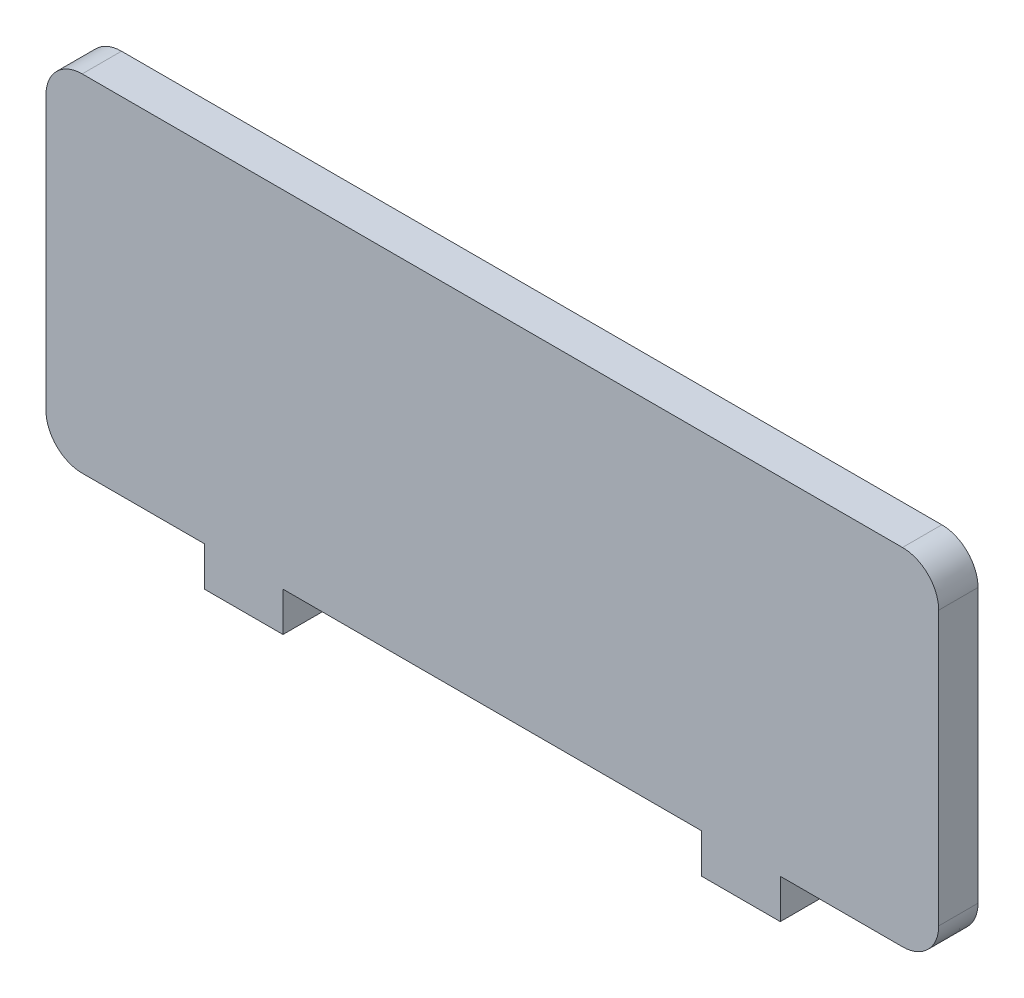
ISO-10303-21;
HEADER;
FILE_DESCRIPTION(('STEP AP214'),'2;1');
FILE_NAME('part.step','',(''),(''),'','','');
FILE_SCHEMA(('AUTOMOTIVE_DESIGN { 1 0 10303 214 1 1 1 1 }'));
ENDSEC;
DATA;
#1=APPLICATION_CONTEXT('core data for automotive mechanical design processes');
#2=APPLICATION_PROTOCOL_DEFINITION('international standard','automotive_design',2000,#1);
#3=PRODUCT_CONTEXT('',#1,'mechanical');
#4=PRODUCT('Part','Part','',(#3));
#5=PRODUCT_RELATED_PRODUCT_CATEGORY('part','',(#4));
#6=PRODUCT_DEFINITION_FORMATION('','',#4);
#7=PRODUCT_DEFINITION_CONTEXT('part definition',#1,'design');
#8=PRODUCT_DEFINITION('design','',#6,#7);
#9=PRODUCT_DEFINITION_SHAPE('','',#8);
#10=(LENGTH_UNIT() NAMED_UNIT(*) SI_UNIT(.MILLI.,.METRE.));
#11=(NAMED_UNIT(*) PLANE_ANGLE_UNIT() SI_UNIT($,.RADIAN.));
#12=(NAMED_UNIT(*) SI_UNIT($,.STERADIAN.) SOLID_ANGLE_UNIT());
#13=UNCERTAINTY_MEASURE_WITH_UNIT(LENGTH_MEASURE(1.E-05),#10,'distance_accuracy_value','');
#14=(GEOMETRIC_REPRESENTATION_CONTEXT(3) GLOBAL_UNCERTAINTY_ASSIGNED_CONTEXT((#13)) GLOBAL_UNIT_ASSIGNED_CONTEXT((#10,
#11,#12)) REPRESENTATION_CONTEXT('',''));
#15=CARTESIAN_POINT('',(0.,0.,0.));
#16=DIRECTION('',(0.,0.,1.));
#17=DIRECTION('',(1.,0.,0.));
#18=AXIS2_PLACEMENT_3D('',#15,#16,#17);
#19=CARTESIAN_POINT('',(238.923745328724,-409.330398118153,-2.3));
#20=DIRECTION('',(0.,-1.,0.));
#21=DIRECTION('',(0.,0.,-1.));
#22=AXIS2_PLACEMENT_3D('',#19,#20,#21);
#23=PLANE('',#22);
#24=DIRECTION('',(0.,0.,1.));
#25=VECTOR('',#24,1.);
#26=CARTESIAN_POINT('',(279.773744644556,-409.330398118153,-2.3));
#27=LINE('',#26,#25);
#28=CARTESIAN_POINT('',(279.773744644556,-409.330398118153,-2.3));
#29=VERTEX_POINT('',#28);
#30=CARTESIAN_POINT('',(279.773744644556,-409.330398118153,0.));
#31=VERTEX_POINT('',#30);
#32=EDGE_CURVE('E232',#29,#31,#27,.T.);
#33=ORIENTED_EDGE('',*,*,#32,.F.);
#34=DIRECTION('',(1.,0.,0.));
#35=VECTOR('',#34,1.);
#36=CARTESIAN_POINT('',(238.923745328724,-409.330398118153,-2.3));
#37=LINE('',#36,#35);
#38=CARTESIAN_POINT('',(286.923743960387,-409.330398118153,-2.3));
#39=VERTEX_POINT('',#38);
#40=EDGE_CURVE('E180',#29,#39,#37,.T.);
#41=ORIENTED_EDGE('',*,*,#40,.T.);
#42=DIRECTION('',(0.,0.,1.));
#43=VECTOR('',#42,1.);
#44=CARTESIAN_POINT('',(286.923743960387,-409.330398118153,-2.3));
#45=LINE('',#44,#43);
#46=CARTESIAN_POINT('',(286.923743960387,-409.330398118153,0.));
#47=VERTEX_POINT('',#46);
#48=EDGE_CURVE('E248',#39,#47,#45,.T.);
#49=ORIENTED_EDGE('',*,*,#48,.T.);
#50=DIRECTION('',(1.,0.,0.));
#51=VECTOR('',#50,1.);
#52=CARTESIAN_POINT('',(238.923745328724,-409.330398118153,0.));
#53=LINE('',#52,#51);
#54=EDGE_CURVE('E236',#31,#47,#53,.T.);
#55=ORIENTED_EDGE('',*,*,#54,.F.);
#56=EDGE_LOOP('',(#33,#41,#49,#55));
#57=FACE_BOUND('',#56,.T.);
#58=ADVANCED_FACE('F36',(#57),#23,.T.);
#59=DIRECTION('',(0.,0.,1.));
#60=VECTOR('',#59,1.);
#61=CARTESIAN_POINT('',(246.073744644556,-409.330398118153,-2.3));
#62=LINE('',#61,#60);
#63=CARTESIAN_POINT('',(246.073744644556,-409.330398118153,-2.3));
#64=VERTEX_POINT('',#63);
#65=CARTESIAN_POINT('',(246.073744644556,-409.330398118153,0.));
#66=VERTEX_POINT('',#65);
#67=EDGE_CURVE('E280',#64,#66,#62,.T.);
#68=ORIENTED_EDGE('',*,*,#67,.T.);
#69=CARTESIAN_POINT('',(238.923745328724,-409.330398118153,0.));
#70=VERTEX_POINT('',#69);
#71=EDGE_CURVE('E291',#70,#66,#53,.T.);
#72=ORIENTED_EDGE('',*,*,#71,.F.);
#73=DIRECTION('',(0.,0.,1.));
#74=VECTOR('',#73,1.);
#75=CARTESIAN_POINT('',(238.923745328724,-409.330398118153,-2.3));
#76=LINE('',#75,#74);
#77=CARTESIAN_POINT('',(238.923745328724,-409.330398118153,-2.3));
#78=VERTEX_POINT('',#77);
#79=EDGE_CURVE('E251',#78,#70,#76,.T.);
#80=ORIENTED_EDGE('',*,*,#79,.F.);
#81=EDGE_CURVE('E179',#78,#64,#37,.T.);
#82=ORIENTED_EDGE('',*,*,#81,.T.);
#83=EDGE_LOOP('',(#68,#72,#80,#82));
#84=FACE_BOUND('',#83,.T.);
#85=ADVANCED_FACE('F212',(#84),#23,.T.);
#86=CARTESIAN_POINT('',(238.923745328724,-389.094251747344,-2.3));
#87=CARTESIAN_POINT('',(237.75575029999,-389.094251747344,-2.3));
#88=CARTESIAN_POINT('',(236.805528369618,-390.044409082176,-2.3));
#89=CARTESIAN_POINT('',(236.805528369618,-391.212296451676,-2.3));
#90=B_SPLINE_CURVE_WITH_KNOTS('',3,(#86,#87,#88,#89),.UNSPECIFIED.,.F.,.F.,(4,4),(1.,2.),.UNSPECIFIED.);
#91=DIRECTION('',(0.,0.,1.));
#92=VECTOR('',#91,1.);
#93=SURFACE_OF_LINEAR_EXTRUSION('',#90,#92);
#94=CARTESIAN_POINT('',(238.923745328724,-389.094251747344,0.));
#95=CARTESIAN_POINT('',(237.75575029999,-389.094251747344,0.));
#96=CARTESIAN_POINT('',(236.805528369618,-390.044409082176,0.));
#97=CARTESIAN_POINT('',(236.805528369618,-391.212296451676,0.));
#98=B_SPLINE_CURVE_WITH_KNOTS('',3,(#94,#95,#96,#97),.UNSPECIFIED.,.F.,.F.,(4,4),(1.,2.),.UNSPECIFIED.);
#99=CARTESIAN_POINT('',(238.923745328724,-389.094251747344,0.));
#100=VERTEX_POINT('',#99);
#101=CARTESIAN_POINT('',(236.805528369618,-391.212296451676,0.));
#102=VERTEX_POINT('',#101);
#103=EDGE_CURVE('E274',#100,#102,#98,.T.);
#104=ORIENTED_EDGE('',*,*,#103,.F.);
#105=DIRECTION('',(0.,0.,1.));
#106=VECTOR('',#105,1.);
#107=CARTESIAN_POINT('',(238.923745328724,-389.094251747344,-2.3));
#108=LINE('',#107,#106);
#109=CARTESIAN_POINT('',(238.923745328724,-389.094251747344,-2.3));
#110=VERTEX_POINT('',#109);
#111=EDGE_CURVE('E11',#110,#100,#108,.T.);
#112=ORIENTED_EDGE('',*,*,#111,.F.);
#113=CARTESIAN_POINT('',(236.805528369618,-391.212296451676,-2.3));
#114=VERTEX_POINT('',#113);
#115=EDGE_CURVE('E317',#110,#114,#90,.T.);
#116=ORIENTED_EDGE('',*,*,#115,.T.);
#117=DIRECTION('',(0.,0.,1.));
#118=VECTOR('',#117,1.);
#119=CARTESIAN_POINT('',(236.805528369618,-391.212296451676,-2.3));
#120=LINE('',#119,#118);
#121=EDGE_CURVE('E41',#114,#102,#120,.T.);
#122=ORIENTED_EDGE('',*,*,#121,.T.);
#123=EDGE_LOOP('',(#104,#112,#116,#122));
#124=FACE_BOUND('',#123,.T.);
#125=ADVANCED_FACE('F38',(#124),#93,.T.);
#126=CARTESIAN_POINT('',(286.923743960387,-389.094251747344,-2.3));
#127=DIRECTION('',(0.,1.,0.));
#128=DIRECTION('',(0.,0.,1.));
#129=AXIS2_PLACEMENT_3D('',#126,#127,#128);
#130=PLANE('',#129);
#131=DIRECTION('',(-1.,0.,0.));
#132=VECTOR('',#131,1.);
#133=CARTESIAN_POINT('',(286.923743960387,-389.094251747344,0.));
#134=LINE('',#133,#132);
#135=CARTESIAN_POINT('',(286.923743960387,-389.094251747344,0.));
#136=VERTEX_POINT('',#135);
#137=EDGE_CURVE('E312',#136,#100,#134,.T.);
#138=ORIENTED_EDGE('',*,*,#137,.F.);
#139=DIRECTION('',(0.,0.,1.));
#140=VECTOR('',#139,1.);
#141=CARTESIAN_POINT('',(286.923743960387,-389.094251747344,-2.3));
#142=LINE('',#141,#140);
#143=CARTESIAN_POINT('',(286.923743960387,-389.094251747344,-2.3));
#144=VERTEX_POINT('',#143);
#145=EDGE_CURVE('E46',#144,#136,#142,.T.);
#146=ORIENTED_EDGE('',*,*,#145,.F.);
#147=DIRECTION('',(-1.,0.,0.));
#148=VECTOR('',#147,1.);
#149=CARTESIAN_POINT('',(286.923743960387,-389.094251747344,-2.3));
#150=LINE('',#149,#148);
#151=EDGE_CURVE('E260',#144,#110,#150,.T.);
#152=ORIENTED_EDGE('',*,*,#151,.T.);
#153=ORIENTED_EDGE('',*,*,#111,.T.);
#154=EDGE_LOOP('',(#138,#146,#152,#153));
#155=FACE_BOUND('',#154,.T.);
#156=ADVANCED_FACE('F367',(#155),#130,.T.);
#157=CARTESIAN_POINT('',(289.041788664719,-391.212296451676,-2.3));
#158=CARTESIAN_POINT('',(289.041788664719,-390.044409082176,-2.3));
#159=CARTESIAN_POINT('',(288.091631329887,-389.094251747344,-2.3));
#160=CARTESIAN_POINT('',(286.923743960387,-389.094251747344,-2.3));
#161=B_SPLINE_CURVE_WITH_KNOTS('',3,(#157,#158,#159,#160),.UNSPECIFIED.,.F.,.F.,(4,4),(7.,8.),.UNSPECIFIED.);
#162=DIRECTION('',(0.,0.,1.));
#163=VECTOR('',#162,1.);
#164=SURFACE_OF_LINEAR_EXTRUSION('',#161,#163);
#165=CARTESIAN_POINT('',(289.041788664719,-391.212296451676,0.));
#166=CARTESIAN_POINT('',(289.041788664719,-390.044409082176,0.));
#167=CARTESIAN_POINT('',(288.091631329887,-389.094251747344,0.));
#168=CARTESIAN_POINT('',(286.923743960387,-389.094251747344,0.));
#169=B_SPLINE_CURVE_WITH_KNOTS('',3,(#165,#166,#167,#168),.UNSPECIFIED.,.F.,.F.,(4,4),(7.,8.),.UNSPECIFIED.);
#170=CARTESIAN_POINT('',(289.041788664719,-391.212296451676,0.));
#171=VERTEX_POINT('',#170);
#172=EDGE_CURVE('E307',#171,#136,#169,.T.);
#173=ORIENTED_EDGE('',*,*,#172,.F.);
#174=DIRECTION('',(0.,0.,1.));
#175=VECTOR('',#174,1.);
#176=CARTESIAN_POINT('',(289.041788664719,-391.212296451676,-2.3));
#177=LINE('',#176,#175);
#178=CARTESIAN_POINT('',(289.041788664719,-391.212296451676,-2.3));
#179=VERTEX_POINT('',#178);
#180=EDGE_CURVE('E253',#179,#171,#177,.T.);
#181=ORIENTED_EDGE('',*,*,#180,.F.);
#182=EDGE_CURVE('E265',#179,#144,#161,.T.);
#183=ORIENTED_EDGE('',*,*,#182,.T.);
#184=ORIENTED_EDGE('',*,*,#145,.T.);
#185=EDGE_LOOP('',(#173,#181,#183,#184));
#186=FACE_BOUND('',#185,.T.);
#187=ADVANCED_FACE('F322',(#186),#164,.T.);
#188=CARTESIAN_POINT('',(289.041788664719,-407.212353413822,-2.3));
#189=DIRECTION('',(1.,0.,0.));
#190=DIRECTION('',(0.,0.,-1.));
#191=AXIS2_PLACEMENT_3D('',#188,#189,#190);
#192=PLANE('',#191);
#193=DIRECTION('',(0.,1.,0.));
#194=VECTOR('',#193,1.);
#195=CARTESIAN_POINT('',(289.041788664719,-407.212353413822,0.));
#196=LINE('',#195,#194);
#197=CARTESIAN_POINT('',(289.041788664719,-407.212353413822,0.));
#198=VERTEX_POINT('',#197);
#199=EDGE_CURVE('E301',#198,#171,#196,.T.);
#200=ORIENTED_EDGE('',*,*,#199,.F.);
#201=DIRECTION('',(0.,0.,1.));
#202=VECTOR('',#201,1.);
#203=CARTESIAN_POINT('',(289.041788664719,-407.212353413822,-2.3));
#204=LINE('',#203,#202);
#205=CARTESIAN_POINT('',(289.041788664719,-407.212353413822,-2.3));
#206=VERTEX_POINT('',#205);
#207=EDGE_CURVE('E246',#206,#198,#204,.T.);
#208=ORIENTED_EDGE('',*,*,#207,.F.);
#209=DIRECTION('',(0.,1.,0.));
#210=VECTOR('',#209,1.);
#211=CARTESIAN_POINT('',(289.041788664719,-407.212353413822,-2.3));
#212=LINE('',#211,#210);
#213=EDGE_CURVE('E196',#206,#179,#212,.T.);
#214=ORIENTED_EDGE('',*,*,#213,.T.);
#215=ORIENTED_EDGE('',*,*,#180,.T.);
#216=EDGE_LOOP('',(#200,#208,#214,#215));
#217=FACE_BOUND('',#216,.T.);
#218=ADVANCED_FACE('F206',(#217),#192,.T.);
#219=CARTESIAN_POINT('',(286.923743960387,-409.330398118153,-2.3));
#220=CARTESIAN_POINT('',(288.091631329887,-409.330398118153,-2.3));
#221=CARTESIAN_POINT('',(289.041788664719,-408.380240783322,-2.3));
#222=CARTESIAN_POINT('',(289.041788664719,-407.212353413822,-2.3));
#223=B_SPLINE_CURVE_WITH_KNOTS('',3,(#219,#220,#221,#222),.UNSPECIFIED.,.F.,.F.,(4,4),(5.,6.),.UNSPECIFIED.);
#224=DIRECTION('',(0.,0.,1.));
#225=VECTOR('',#224,1.);
#226=SURFACE_OF_LINEAR_EXTRUSION('',#223,#225);
#227=CARTESIAN_POINT('',(286.923743960387,-409.330398118153,0.));
#228=CARTESIAN_POINT('',(288.091631329887,-409.330398118153,0.));
#229=CARTESIAN_POINT('',(289.041788664719,-408.380240783322,0.));
#230=CARTESIAN_POINT('',(289.041788664719,-407.212353413822,0.));
#231=B_SPLINE_CURVE_WITH_KNOTS('',3,(#227,#228,#229,#230),.UNSPECIFIED.,.F.,.F.,(4,4),(5.,6.),.UNSPECIFIED.);
#232=EDGE_CURVE('E250',#47,#198,#231,.T.);
#233=ORIENTED_EDGE('',*,*,#232,.F.);
#234=ORIENTED_EDGE('',*,*,#48,.F.);
#235=EDGE_CURVE('E183',#39,#206,#223,.T.);
#236=ORIENTED_EDGE('',*,*,#235,.T.);
#237=ORIENTED_EDGE('',*,*,#207,.T.);
#238=EDGE_LOOP('',(#233,#234,#236,#237));
#239=FACE_BOUND('',#238,.T.);
#240=ADVANCED_FACE('F202',(#239),#226,.T.);
#241=DIRECTION('',(0.,0.,1.));
#242=VECTOR('',#241,1.);
#243=CARTESIAN_POINT('',(275.173744644556,-409.330398118153,-2.3));
#244=LINE('',#243,#242);
#245=CARTESIAN_POINT('',(275.173744644556,-409.330398118153,-2.3));
#246=VERTEX_POINT('',#245);
#247=CARTESIAN_POINT('',(275.173744644556,-409.330398118153,0.));
#248=VERTEX_POINT('',#247);
#249=EDGE_CURVE('E153',#246,#248,#244,.T.);
#250=ORIENTED_EDGE('',*,*,#249,.T.);
#251=CARTESIAN_POINT('',(250.673744644556,-409.330398118153,0.));
#252=VERTEX_POINT('',#251);
#253=EDGE_CURVE('E297',#252,#248,#53,.T.);
#254=ORIENTED_EDGE('',*,*,#253,.F.);
#255=DIRECTION('',(0.,0.,1.));
#256=VECTOR('',#255,1.);
#257=CARTESIAN_POINT('',(250.673744644556,-409.330398118153,-2.3));
#258=LINE('',#257,#256);
#259=CARTESIAN_POINT('',(250.673744644556,-409.330398118153,-2.3));
#260=VERTEX_POINT('',#259);
#261=EDGE_CURVE('E178',#260,#252,#258,.T.);
#262=ORIENTED_EDGE('',*,*,#261,.F.);
#263=EDGE_CURVE('E171',#260,#246,#37,.T.);
#264=ORIENTED_EDGE('',*,*,#263,.T.);
#265=EDGE_LOOP('',(#250,#254,#262,#264));
#266=FACE_BOUND('',#265,.T.);
#267=ADVANCED_FACE('F177',(#266),#23,.T.);
#268=CARTESIAN_POINT('',(236.805528369618,-407.212353413822,-2.3));
#269=CARTESIAN_POINT('',(236.805528369618,-408.380240783322,-2.3));
#270=CARTESIAN_POINT('',(237.75575029999,-409.330398118153,-2.3));
#271=CARTESIAN_POINT('',(238.923745328724,-409.330398118153,-2.3));
#272=B_SPLINE_CURVE_WITH_KNOTS('',3,(#268,#269,#270,#271),.UNSPECIFIED.,.F.,.F.,(4,4),(3.,4.),.UNSPECIFIED.);
#273=DIRECTION('',(0.,0.,1.));
#274=VECTOR('',#273,1.);
#275=SURFACE_OF_LINEAR_EXTRUSION('',#272,#274);
#276=CARTESIAN_POINT('',(236.805528369618,-407.212353413822,0.));
#277=CARTESIAN_POINT('',(236.805528369618,-408.380240783322,0.));
#278=CARTESIAN_POINT('',(237.75575029999,-409.330398118153,0.));
#279=CARTESIAN_POINT('',(238.923745328724,-409.330398118153,0.));
#280=B_SPLINE_CURVE_WITH_KNOTS('',3,(#276,#277,#278,#279),.UNSPECIFIED.,.F.,.F.,(4,4),(3.,4.),.UNSPECIFIED.);
#281=CARTESIAN_POINT('',(236.805528369618,-407.212353413822,0.));
#282=VERTEX_POINT('',#281);
#283=EDGE_CURVE('E286',#282,#70,#280,.T.);
#284=ORIENTED_EDGE('',*,*,#283,.F.);
#285=DIRECTION('',(0.,0.,1.));
#286=VECTOR('',#285,1.);
#287=CARTESIAN_POINT('',(236.805528369618,-407.212353413822,-2.3));
#288=LINE('',#287,#286);
#289=CARTESIAN_POINT('',(236.805528369618,-407.212353413822,-2.3));
#290=VERTEX_POINT('',#289);
#291=EDGE_CURVE('E255',#290,#282,#288,.T.);
#292=ORIENTED_EDGE('',*,*,#291,.F.);
#293=EDGE_CURVE('E184',#290,#78,#272,.T.);
#294=ORIENTED_EDGE('',*,*,#293,.T.);
#295=ORIENTED_EDGE('',*,*,#79,.T.);
#296=EDGE_LOOP('',(#284,#292,#294,#295));
#297=FACE_BOUND('',#296,.T.);
#298=ADVANCED_FACE('F211',(#297),#275,.T.);
#299=CARTESIAN_POINT('',(236.805528369618,-391.212296451676,-2.3));
#300=DIRECTION('',(-1.,0.,0.));
#301=DIRECTION('',(0.,0.,1.));
#302=AXIS2_PLACEMENT_3D('',#299,#300,#301);
#303=PLANE('',#302);
#304=DIRECTION('',(0.,-1.,0.));
#305=VECTOR('',#304,1.);
#306=CARTESIAN_POINT('',(236.805528369618,-391.212296451676,0.));
#307=LINE('',#306,#305);
#308=EDGE_CURVE('E279',#102,#282,#307,.T.);
#309=ORIENTED_EDGE('',*,*,#308,.F.);
#310=ORIENTED_EDGE('',*,*,#121,.F.);
#311=DIRECTION('',(0.,-1.,0.));
#312=VECTOR('',#311,1.);
#313=CARTESIAN_POINT('',(236.805528369618,-391.212296451676,-2.3));
#314=LINE('',#313,#312);
#315=EDGE_CURVE('E356',#114,#290,#314,.T.);
#316=ORIENTED_EDGE('',*,*,#315,.T.);
#317=ORIENTED_EDGE('',*,*,#291,.T.);
#318=EDGE_LOOP('',(#309,#310,#316,#317));
#319=FACE_BOUND('',#318,.T.);
#320=ADVANCED_FACE('F214',(#319),#303,.T.);
#321=CARTESIAN_POINT('',(237.426638713396,-389.715316335948,-2.3));
#322=DIRECTION('',(0.,0.,-1.));
#323=DIRECTION('',(-1.,0.,0.));
#324=AXIS2_PLACEMENT_3D('',#321,#322,#323);
#325=PLANE('',#324);
#326=ORIENTED_EDGE('',*,*,#115,.F.);
#327=ORIENTED_EDGE('',*,*,#151,.F.);
#328=ORIENTED_EDGE('',*,*,#182,.F.);
#329=ORIENTED_EDGE('',*,*,#213,.F.);
#330=ORIENTED_EDGE('',*,*,#235,.F.);
#331=ORIENTED_EDGE('',*,*,#40,.F.);
#332=DIRECTION('',(0.,1.,0.));
#333=VECTOR('',#332,1.);
#334=CARTESIAN_POINT('',(279.773744644556,-409.330398118153,-2.3));
#335=LINE('',#334,#333);
#336=CARTESIAN_POINT('',(279.773744644556,-411.630398118153,-2.3));
#337=VERTEX_POINT('',#336);
#338=EDGE_CURVE('E163',#337,#29,#335,.T.);
#339=ORIENTED_EDGE('',*,*,#338,.F.);
#340=DIRECTION('',(1.,0.,0.));
#341=VECTOR('',#340,1.);
#342=CARTESIAN_POINT('',(279.773744644556,-411.630398118153,-2.3));
#343=LINE('',#342,#341);
#344=CARTESIAN_POINT('',(275.173744644556,-411.630398118153,-2.3));
#345=VERTEX_POINT('',#344);
#346=EDGE_CURVE('E174',#345,#337,#343,.T.);
#347=ORIENTED_EDGE('',*,*,#346,.F.);
#348=DIRECTION('',(0.,-1.,0.));
#349=VECTOR('',#348,1.);
#350=CARTESIAN_POINT('',(275.173744644556,-409.330398118153,-2.3));
#351=LINE('',#350,#349);
#352=EDGE_CURVE('E156',#246,#345,#351,.T.);
#353=ORIENTED_EDGE('',*,*,#352,.F.);
#354=ORIENTED_EDGE('',*,*,#263,.F.);
#355=DIRECTION('',(0.,1.,0.));
#356=VECTOR('',#355,1.);
#357=CARTESIAN_POINT('',(250.673744644556,-409.330398118153,-2.3));
#358=LINE('',#357,#356);
#359=CARTESIAN_POINT('',(250.673744644556,-411.630398118153,-2.3));
#360=VERTEX_POINT('',#359);
#361=EDGE_CURVE('E340',#360,#260,#358,.T.);
#362=ORIENTED_EDGE('',*,*,#361,.F.);
#363=DIRECTION('',(1.,0.,0.));
#364=VECTOR('',#363,1.);
#365=CARTESIAN_POINT('',(246.073744644556,-411.630398118153,-2.3));
#366=LINE('',#365,#364);
#367=CARTESIAN_POINT('',(246.073744644556,-411.630398118153,-2.3));
#368=VERTEX_POINT('',#367);
#369=EDGE_CURVE('E337',#368,#360,#366,.T.);
#370=ORIENTED_EDGE('',*,*,#369,.F.);
#371=DIRECTION('',(0.,-1.,0.));
#372=VECTOR('',#371,1.);
#373=CARTESIAN_POINT('',(246.073744644556,-409.330398118153,-2.3));
#374=LINE('',#373,#372);
#375=EDGE_CURVE('E334',#64,#368,#374,.T.);
#376=ORIENTED_EDGE('',*,*,#375,.F.);
#377=ORIENTED_EDGE('',*,*,#81,.F.);
#378=ORIENTED_EDGE('',*,*,#293,.F.);
#379=ORIENTED_EDGE('',*,*,#315,.F.);
#380=EDGE_LOOP('',(#326,#327,#328,#329,#330,#331,#339,#347,#353,#354,#362,#370,#376,#377,#378,#379));
#381=FACE_BOUND('',#380,.T.);
#382=ADVANCED_FACE('F169',(#381),#325,.T.);
#383=CARTESIAN_POINT('',(237.426638713396,-389.715316335948,0.));
#384=DIRECTION('',(0.,0.,-1.));
#385=DIRECTION('',(-1.,0.,0.));
#386=AXIS2_PLACEMENT_3D('',#383,#384,#385);
#387=PLANE('',#386);
#388=ORIENTED_EDGE('',*,*,#103,.T.);
#389=ORIENTED_EDGE('',*,*,#308,.T.);
#390=ORIENTED_EDGE('',*,*,#283,.T.);
#391=ORIENTED_EDGE('',*,*,#71,.T.);
#392=DIRECTION('',(0.,-1.,0.));
#393=VECTOR('',#392,1.);
#394=CARTESIAN_POINT('',(246.073744644556,-409.330398118153,0.));
#395=LINE('',#394,#393);
#396=CARTESIAN_POINT('',(246.073744644556,-411.630398118153,0.));
#397=VERTEX_POINT('',#396);
#398=EDGE_CURVE('E238',#66,#397,#395,.T.);
#399=ORIENTED_EDGE('',*,*,#398,.T.);
#400=DIRECTION('',(1.,0.,0.));
#401=VECTOR('',#400,1.);
#402=CARTESIAN_POINT('',(246.073744644556,-411.630398118153,0.));
#403=LINE('',#402,#401);
#404=CARTESIAN_POINT('',(250.673744644556,-411.630398118153,0.));
#405=VERTEX_POINT('',#404);
#406=EDGE_CURVE('E345',#397,#405,#403,.T.);
#407=ORIENTED_EDGE('',*,*,#406,.T.);
#408=DIRECTION('',(0.,1.,0.));
#409=VECTOR('',#408,1.);
#410=CARTESIAN_POINT('',(250.673744644556,-409.330398118153,0.));
#411=LINE('',#410,#409);
#412=EDGE_CURVE('E61',#405,#252,#411,.T.);
#413=ORIENTED_EDGE('',*,*,#412,.T.);
#414=ORIENTED_EDGE('',*,*,#253,.T.);
#415=DIRECTION('',(0.,-1.,0.));
#416=VECTOR('',#415,1.);
#417=CARTESIAN_POINT('',(275.173744644556,-409.330398118153,0.));
#418=LINE('',#417,#416);
#419=CARTESIAN_POINT('',(275.173744644556,-411.630398118153,0.));
#420=VERTEX_POINT('',#419);
#421=EDGE_CURVE('E158',#248,#420,#418,.T.);
#422=ORIENTED_EDGE('',*,*,#421,.T.);
#423=DIRECTION('',(1.,0.,0.));
#424=VECTOR('',#423,1.);
#425=CARTESIAN_POINT('',(279.773744644556,-411.630398118153,0.));
#426=LINE('',#425,#424);
#427=CARTESIAN_POINT('',(279.773744644556,-411.630398118153,0.));
#428=VERTEX_POINT('',#427);
#429=EDGE_CURVE('E325',#420,#428,#426,.T.);
#430=ORIENTED_EDGE('',*,*,#429,.T.);
#431=DIRECTION('',(0.,1.,0.));
#432=VECTOR('',#431,1.);
#433=CARTESIAN_POINT('',(279.773744644556,-409.330398118153,0.));
#434=LINE('',#433,#432);
#435=EDGE_CURVE('E54',#428,#31,#434,.T.);
#436=ORIENTED_EDGE('',*,*,#435,.T.);
#437=ORIENTED_EDGE('',*,*,#54,.T.);
#438=ORIENTED_EDGE('',*,*,#232,.T.);
#439=ORIENTED_EDGE('',*,*,#199,.T.);
#440=ORIENTED_EDGE('',*,*,#172,.T.);
#441=ORIENTED_EDGE('',*,*,#137,.T.);
#442=EDGE_LOOP('',(#388,#389,#390,#391,#399,#407,#413,#414,#422,#430,#436,#437,#438,#439,#440,#441));
#443=FACE_BOUND('',#442,.T.);
#444=ADVANCED_FACE('F221',(#443),#387,.F.);
#445=CARTESIAN_POINT('',(246.073744644556,-409.330398118153,-2.3));
#446=DIRECTION('',(-1.,0.,0.));
#447=DIRECTION('',(0.,0.,1.));
#448=AXIS2_PLACEMENT_3D('',#445,#446,#447);
#449=PLANE('',#448);
#450=ORIENTED_EDGE('',*,*,#398,.F.);
#451=ORIENTED_EDGE('',*,*,#67,.F.);
#452=ORIENTED_EDGE('',*,*,#375,.T.);
#453=DIRECTION('',(0.,0.,1.));
#454=VECTOR('',#453,1.);
#455=CARTESIAN_POINT('',(246.073744644556,-411.630398118153,-2.3));
#456=LINE('',#455,#454);
#457=EDGE_CURVE('E342',#368,#397,#456,.T.);
#458=ORIENTED_EDGE('',*,*,#457,.T.);
#459=EDGE_LOOP('',(#450,#451,#452,#458));
#460=FACE_BOUND('',#459,.T.);
#461=ADVANCED_FACE('F376',(#460),#449,.T.);
#462=CARTESIAN_POINT('',(250.673744644556,-409.330398118153,-2.3));
#463=DIRECTION('',(1.,0.,0.));
#464=DIRECTION('',(0.,0.,-1.));
#465=AXIS2_PLACEMENT_3D('',#462,#463,#464);
#466=PLANE('',#465);
#467=ORIENTED_EDGE('',*,*,#412,.F.);
#468=DIRECTION('',(0.,0.,1.));
#469=VECTOR('',#468,1.);
#470=CARTESIAN_POINT('',(250.673744644556,-411.630398118153,-2.3));
#471=LINE('',#470,#469);
#472=EDGE_CURVE('E351',#360,#405,#471,.T.);
#473=ORIENTED_EDGE('',*,*,#472,.F.);
#474=ORIENTED_EDGE('',*,*,#361,.T.);
#475=ORIENTED_EDGE('',*,*,#261,.T.);
#476=EDGE_LOOP('',(#467,#473,#474,#475));
#477=FACE_BOUND('',#476,.T.);
#478=ADVANCED_FACE('F380',(#477),#466,.T.);
#479=CARTESIAN_POINT('',(246.073744644556,-411.630398118153,-2.3));
#480=DIRECTION('',(0.,-1.,0.));
#481=DIRECTION('',(0.,0.,-1.));
#482=AXIS2_PLACEMENT_3D('',#479,#480,#481);
#483=PLANE('',#482);
#484=ORIENTED_EDGE('',*,*,#406,.F.);
#485=ORIENTED_EDGE('',*,*,#457,.F.);
#486=ORIENTED_EDGE('',*,*,#369,.T.);
#487=ORIENTED_EDGE('',*,*,#472,.T.);
#488=EDGE_LOOP('',(#484,#485,#486,#487));
#489=FACE_BOUND('',#488,.T.);
#490=ADVANCED_FACE('F382',(#489),#483,.T.);
#491=CARTESIAN_POINT('',(279.773744644556,-409.330398118153,-2.3));
#492=DIRECTION('',(1.,0.,0.));
#493=DIRECTION('',(0.,0.,-1.));
#494=AXIS2_PLACEMENT_3D('',#491,#492,#493);
#495=PLANE('',#494);
#496=ORIENTED_EDGE('',*,*,#435,.F.);
#497=DIRECTION('',(0.,0.,1.));
#498=VECTOR('',#497,1.);
#499=CARTESIAN_POINT('',(279.773744644556,-411.630398118153,-2.3));
#500=LINE('',#499,#498);
#501=EDGE_CURVE('E239',#337,#428,#500,.T.);
#502=ORIENTED_EDGE('',*,*,#501,.F.);
#503=ORIENTED_EDGE('',*,*,#338,.T.);
#504=ORIENTED_EDGE('',*,*,#32,.T.);
#505=EDGE_LOOP('',(#496,#502,#503,#504));
#506=FACE_BOUND('',#505,.T.);
#507=ADVANCED_FACE('F385',(#506),#495,.T.);
#508=CARTESIAN_POINT('',(279.773744644556,-411.630398118153,-2.3));
#509=DIRECTION('',(0.,-1.,0.));
#510=DIRECTION('',(0.,0.,-1.));
#511=AXIS2_PLACEMENT_3D('',#508,#509,#510);
#512=PLANE('',#511);
#513=ORIENTED_EDGE('',*,*,#429,.F.);
#514=DIRECTION('',(0.,0.,1.));
#515=VECTOR('',#514,1.);
#516=CARTESIAN_POINT('',(275.173744644556,-411.630398118153,-2.3));
#517=LINE('',#516,#515);
#518=EDGE_CURVE('E162',#345,#420,#517,.T.);
#519=ORIENTED_EDGE('',*,*,#518,.F.);
#520=ORIENTED_EDGE('',*,*,#346,.T.);
#521=ORIENTED_EDGE('',*,*,#501,.T.);
#522=EDGE_LOOP('',(#513,#519,#520,#521));
#523=FACE_BOUND('',#522,.T.);
#524=ADVANCED_FACE('F392',(#523),#512,.T.);
#525=CARTESIAN_POINT('',(275.173744644556,-409.330398118153,-2.3));
#526=DIRECTION('',(-1.,0.,0.));
#527=DIRECTION('',(0.,0.,1.));
#528=AXIS2_PLACEMENT_3D('',#525,#526,#527);
#529=PLANE('',#528);
#530=ORIENTED_EDGE('',*,*,#421,.F.);
#531=ORIENTED_EDGE('',*,*,#249,.F.);
#532=ORIENTED_EDGE('',*,*,#352,.T.);
#533=ORIENTED_EDGE('',*,*,#518,.T.);
#534=EDGE_LOOP('',(#530,#531,#532,#533));
#535=FACE_BOUND('',#534,.T.);
#536=ADVANCED_FACE('F155',(#535),#529,.T.);
#537=CLOSED_SHELL('',(#58,#85,#125,#156,#187,#218,#240,#267,#298,#320,#382,#444,#461,#478,#490,
#507,#524,#536));
#538=MANIFOLD_SOLID_BREP('B2',#537);
#539=ADVANCED_BREP_SHAPE_REPRESENTATION('',(#18,#538),#14);
#540=SHAPE_DEFINITION_REPRESENTATION(#9,#539);
ENDSEC;
END-ISO-10303-21;
